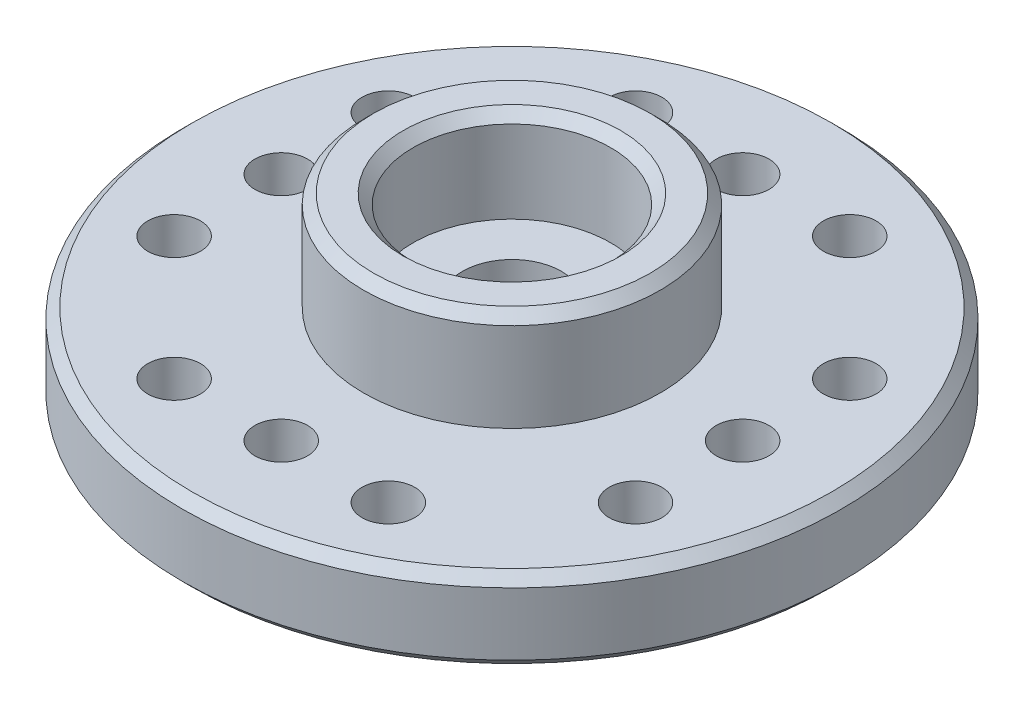
ISO-10303-21;
HEADER;
FILE_DESCRIPTION(('STEP AP214'),'2;1');
FILE_NAME('part.step','',(''),(''),'','','');
FILE_SCHEMA(('AUTOMOTIVE_DESIGN { 1 0 10303 214 1 1 1 1 }'));
ENDSEC;
DATA;
#1=APPLICATION_CONTEXT('core data for automotive mechanical design processes');
#2=APPLICATION_PROTOCOL_DEFINITION('international standard','automotive_design',2000,#1);
#3=PRODUCT_CONTEXT('',#1,'mechanical');
#4=PRODUCT('Part','Part','',(#3));
#5=PRODUCT_RELATED_PRODUCT_CATEGORY('part','',(#4));
#6=PRODUCT_DEFINITION_FORMATION('','',#4);
#7=PRODUCT_DEFINITION_CONTEXT('part definition',#1,'design');
#8=PRODUCT_DEFINITION('design','',#6,#7);
#9=PRODUCT_DEFINITION_SHAPE('','',#8);
#10=(LENGTH_UNIT() NAMED_UNIT(*) SI_UNIT(.MILLI.,.METRE.));
#11=(NAMED_UNIT(*) PLANE_ANGLE_UNIT() SI_UNIT($,.RADIAN.));
#12=(NAMED_UNIT(*) SI_UNIT($,.STERADIAN.) SOLID_ANGLE_UNIT());
#13=UNCERTAINTY_MEASURE_WITH_UNIT(LENGTH_MEASURE(1.E-05),#10,'distance_accuracy_value','');
#14=(GEOMETRIC_REPRESENTATION_CONTEXT(3) GLOBAL_UNCERTAINTY_ASSIGNED_CONTEXT((#13)) GLOBAL_UNIT_ASSIGNED_CONTEXT((#10,
#11,#12)) REPRESENTATION_CONTEXT('',''));
#15=CARTESIAN_POINT('',(0.,0.,0.));
#16=DIRECTION('',(0.,0.,1.));
#17=DIRECTION('',(1.,0.,0.));
#18=AXIS2_PLACEMENT_3D('',#15,#16,#17);
#19=CARTESIAN_POINT('',(0.,5.5,0.));
#20=DIRECTION('',(0.,-1.,0.));
#21=DIRECTION('',(0.,0.,-1.));
#22=AXIS2_PLACEMENT_3D('',#19,#20,#21);
#23=CYLINDRICAL_SURFACE('',#22,1.5);
#24=CARTESIAN_POINT('',(0.,2.7,0.));
#25=DIRECTION('',(0.,1.,0.));
#26=DIRECTION('',(0.,0.,1.));
#27=AXIS2_PLACEMENT_3D('',#24,#25,#26);
#28=CIRCLE('',#27,1.5);
#29=CARTESIAN_POINT('',(0.,2.7,1.5));
#30=VERTEX_POINT('',#29);
#31=EDGE_CURVE('E77',#30,#30,#28,.T.);
#32=ORIENTED_EDGE('',*,*,#31,.T.);
#33=EDGE_LOOP('',(#32));
#34=FACE_BOUND('',#33,.T.);
#35=CARTESIAN_POINT('',(0.,1.,0.));
#36=DIRECTION('',(0.,-1.,0.));
#37=DIRECTION('',(0.,0.,-1.));
#38=AXIS2_PLACEMENT_3D('',#35,#36,#37);
#39=CIRCLE('',#38,1.5);
#40=CARTESIAN_POINT('',(0.,1.,-1.5));
#41=VERTEX_POINT('',#40);
#42=EDGE_CURVE('E161',#41,#41,#39,.F.);
#43=ORIENTED_EDGE('',*,*,#42,.F.);
#44=EDGE_LOOP('',(#43));
#45=FACE_BOUND('',#44,.T.);
#46=ADVANCED_FACE('F43',(#34,#45),#23,.F.);
#47=CARTESIAN_POINT('',(0.,2.5,0.));
#48=DIRECTION('',(0.,-1.,0.));
#49=DIRECTION('',(0.,0.,-1.));
#50=AXIS2_PLACEMENT_3D('',#47,#48,#49);
#51=CYLINDRICAL_SURFACE('',#50,10.);
#52=CARTESIAN_POINT('',(0.,0.299999999999996,0.));
#53=DIRECTION('',(0.,1.,0.));
#54=DIRECTION('',(0.,0.,1.));
#55=AXIS2_PLACEMENT_3D('',#52,#53,#54);
#56=CIRCLE('',#55,10.);
#57=CARTESIAN_POINT('',(0.,0.299999999999996,10.));
#58=VERTEX_POINT('',#57);
#59=EDGE_CURVE('E70',#58,#58,#56,.T.);
#60=ORIENTED_EDGE('',*,*,#59,.T.);
#61=EDGE_LOOP('',(#60));
#62=FACE_BOUND('',#61,.T.);
#63=CARTESIAN_POINT('',(0.,2.19999999999999,0.));
#64=DIRECTION('',(0.,1.,0.));
#65=DIRECTION('',(0.,0.,1.));
#66=AXIS2_PLACEMENT_3D('',#63,#64,#65);
#67=CIRCLE('',#66,10.);
#68=CARTESIAN_POINT('',(0.,2.19999999999999,10.));
#69=VERTEX_POINT('',#68);
#70=EDGE_CURVE('E73',#69,#69,#67,.F.);
#71=ORIENTED_EDGE('',*,*,#70,.T.);
#72=EDGE_LOOP('',(#71));
#73=FACE_BOUND('',#72,.T.);
#74=ADVANCED_FACE('F245',(#62,#73),#51,.T.);
#75=CARTESIAN_POINT('',(0.,2.5,0.));
#76=DIRECTION('',(0.,1.,0.));
#77=DIRECTION('',(0.,0.,1.));
#78=AXIS2_PLACEMENT_3D('',#75,#76,#77);
#79=PLANE('',#78);
#80=CARTESIAN_POINT('',(0.,2.5,0.));
#81=DIRECTION('',(0.,1.,0.));
#82=DIRECTION('',(0.,0.,1.));
#83=AXIS2_PLACEMENT_3D('',#80,#81,#82);
#84=CIRCLE('',#83,9.69999999999999);
#85=CARTESIAN_POINT('',(0.,2.5,9.69999999999999));
#86=VERTEX_POINT('',#85);
#87=EDGE_CURVE('E64',#86,#86,#84,.T.);
#88=ORIENTED_EDGE('',*,*,#87,.T.);
#89=EDGE_LOOP('',(#88));
#90=FACE_BOUND('',#89,.T.);
#91=CARTESIAN_POINT('',(3.25,2.5,-7.));
#92=DIRECTION('',(0.,1.,0.));
#93=DIRECTION('',(0.,0.,1.));
#94=AXIS2_PLACEMENT_3D('',#91,#92,#93);
#95=CIRCLE('',#94,0.8);
#96=CARTESIAN_POINT('',(3.25,2.5,-6.2));
#97=VERTEX_POINT('',#96);
#98=EDGE_CURVE('E87',#97,#97,#95,.T.);
#99=ORIENTED_EDGE('',*,*,#98,.F.);
#100=EDGE_LOOP('',(#99));
#101=FACE_BOUND('',#100,.T.);
#102=CARTESIAN_POINT('',(0.,2.5,-7.));
#103=DIRECTION('',(0.,1.,0.));
#104=DIRECTION('',(0.,0.,1.));
#105=AXIS2_PLACEMENT_3D('',#102,#103,#104);
#106=CIRCLE('',#105,0.8);
#107=CARTESIAN_POINT('',(0.,2.5,-6.2));
#108=VERTEX_POINT('',#107);
#109=EDGE_CURVE('E90',#108,#108,#106,.T.);
#110=ORIENTED_EDGE('',*,*,#109,.F.);
#111=EDGE_LOOP('',(#110));
#112=FACE_BOUND('',#111,.T.);
#113=CARTESIAN_POINT('',(7.,2.5,-3.25));
#114=DIRECTION('',(0.,1.,0.));
#115=DIRECTION('',(0.,0.,1.));
#116=AXIS2_PLACEMENT_3D('',#113,#114,#115);
#117=CIRCLE('',#116,0.800000000000001);
#118=CARTESIAN_POINT('',(7.,2.5,-2.45));
#119=VERTEX_POINT('',#118);
#120=EDGE_CURVE('E93',#119,#119,#117,.T.);
#121=ORIENTED_EDGE('',*,*,#120,.F.);
#122=EDGE_LOOP('',(#121));
#123=FACE_BOUND('',#122,.T.);
#124=CARTESIAN_POINT('',(7.,2.5,3.25));
#125=DIRECTION('',(0.,1.,0.));
#126=DIRECTION('',(0.,0.,1.));
#127=AXIS2_PLACEMENT_3D('',#124,#125,#126);
#128=CIRCLE('',#127,0.800000000000001);
#129=CARTESIAN_POINT('',(7.,2.5,4.05));
#130=VERTEX_POINT('',#129);
#131=EDGE_CURVE('E96',#130,#130,#128,.T.);
#132=ORIENTED_EDGE('',*,*,#131,.F.);
#133=EDGE_LOOP('',(#132));
#134=FACE_BOUND('',#133,.T.);
#135=CARTESIAN_POINT('',(3.25,2.5,7.));
#136=DIRECTION('',(0.,1.,0.));
#137=DIRECTION('',(0.,0.,1.));
#138=AXIS2_PLACEMENT_3D('',#135,#136,#137);
#139=CIRCLE('',#138,0.8);
#140=CARTESIAN_POINT('',(3.25,2.5,7.8));
#141=VERTEX_POINT('',#140);
#142=EDGE_CURVE('E99',#141,#141,#139,.T.);
#143=ORIENTED_EDGE('',*,*,#142,.F.);
#144=EDGE_LOOP('',(#143));
#145=FACE_BOUND('',#144,.T.);
#146=CARTESIAN_POINT('',(-3.25,2.5,7.));
#147=DIRECTION('',(0.,1.,0.));
#148=DIRECTION('',(0.,0.,1.));
#149=AXIS2_PLACEMENT_3D('',#146,#147,#148);
#150=CIRCLE('',#149,0.8);
#151=CARTESIAN_POINT('',(-3.25,2.5,7.8));
#152=VERTEX_POINT('',#151);
#153=EDGE_CURVE('E102',#152,#152,#150,.T.);
#154=ORIENTED_EDGE('',*,*,#153,.F.);
#155=EDGE_LOOP('',(#154));
#156=FACE_BOUND('',#155,.T.);
#157=CARTESIAN_POINT('',(7.,2.5,0.));
#158=DIRECTION('',(0.,1.,0.));
#159=DIRECTION('',(0.,0.,1.));
#160=AXIS2_PLACEMENT_3D('',#157,#158,#159);
#161=CIRCLE('',#160,0.8);
#162=CARTESIAN_POINT('',(7.,2.5,0.800000000000002));
#163=VERTEX_POINT('',#162);
#164=EDGE_CURVE('E105',#163,#163,#161,.T.);
#165=ORIENTED_EDGE('',*,*,#164,.F.);
#166=EDGE_LOOP('',(#165));
#167=FACE_BOUND('',#166,.T.);
#168=CARTESIAN_POINT('',(-7.,2.5,3.25));
#169=DIRECTION('',(0.,1.,0.));
#170=DIRECTION('',(0.,0.,1.));
#171=AXIS2_PLACEMENT_3D('',#168,#169,#170);
#172=CIRCLE('',#171,0.800000000000001);
#173=CARTESIAN_POINT('',(-7.,2.5,4.05));
#174=VERTEX_POINT('',#173);
#175=EDGE_CURVE('E108',#174,#174,#172,.T.);
#176=ORIENTED_EDGE('',*,*,#175,.F.);
#177=EDGE_LOOP('',(#176));
#178=FACE_BOUND('',#177,.T.);
#179=CARTESIAN_POINT('',(-7.,2.5,-3.25));
#180=DIRECTION('',(0.,1.,0.));
#181=DIRECTION('',(0.,0.,1.));
#182=AXIS2_PLACEMENT_3D('',#179,#180,#181);
#183=CIRCLE('',#182,0.800000000000001);
#184=CARTESIAN_POINT('',(-7.,2.5,-2.45));
#185=VERTEX_POINT('',#184);
#186=EDGE_CURVE('E111',#185,#185,#183,.T.);
#187=ORIENTED_EDGE('',*,*,#186,.F.);
#188=EDGE_LOOP('',(#187));
#189=FACE_BOUND('',#188,.T.);
#190=CARTESIAN_POINT('',(-7.,2.5,0.));
#191=DIRECTION('',(0.,1.,0.));
#192=DIRECTION('',(0.,0.,1.));
#193=AXIS2_PLACEMENT_3D('',#190,#191,#192);
#194=CIRCLE('',#193,0.800000000000001);
#195=CARTESIAN_POINT('',(-7.,2.5,0.8));
#196=VERTEX_POINT('',#195);
#197=EDGE_CURVE('E114',#196,#196,#194,.T.);
#198=ORIENTED_EDGE('',*,*,#197,.F.);
#199=EDGE_LOOP('',(#198));
#200=FACE_BOUND('',#199,.T.);
#201=CARTESIAN_POINT('',(-3.25,2.5,-7.));
#202=DIRECTION('',(0.,1.,0.));
#203=DIRECTION('',(0.,0.,1.));
#204=AXIS2_PLACEMENT_3D('',#201,#202,#203);
#205=CIRCLE('',#204,0.8);
#206=CARTESIAN_POINT('',(-3.25,2.5,-6.2));
#207=VERTEX_POINT('',#206);
#208=EDGE_CURVE('E117',#207,#207,#205,.T.);
#209=ORIENTED_EDGE('',*,*,#208,.F.);
#210=EDGE_LOOP('',(#209));
#211=FACE_BOUND('',#210,.T.);
#212=CARTESIAN_POINT('',(0.,2.5,7.));
#213=DIRECTION('',(0.,1.,0.));
#214=DIRECTION('',(0.,0.,1.));
#215=AXIS2_PLACEMENT_3D('',#212,#213,#214);
#216=CIRCLE('',#215,0.8);
#217=CARTESIAN_POINT('',(0.,2.5,7.8));
#218=VERTEX_POINT('',#217);
#219=EDGE_CURVE('E80',#218,#218,#216,.T.);
#220=ORIENTED_EDGE('',*,*,#219,.F.);
#221=EDGE_LOOP('',(#220));
#222=FACE_BOUND('',#221,.T.);
#223=CARTESIAN_POINT('',(0.,2.5,0.));
#224=DIRECTION('',(0.,1.,0.));
#225=DIRECTION('',(0.,0.,1.));
#226=AXIS2_PLACEMENT_3D('',#223,#224,#225);
#227=CIRCLE('',#226,4.5);
#228=CARTESIAN_POINT('',(0.,2.5,4.5));
#229=VERTEX_POINT('',#228);
#230=EDGE_CURVE('E76',#229,#229,#227,.T.);
#231=ORIENTED_EDGE('',*,*,#230,.F.);
#232=EDGE_LOOP('',(#231));
#233=FACE_BOUND('',#232,.T.);
#234=ADVANCED_FACE('F198',(#90,#101,#112,#123,#134,#145,#156,#167,#178,#189,#200,#211,#222,
#233),#79,.T.);
#235=CARTESIAN_POINT('',(0.,0.,0.));
#236=DIRECTION('',(0.,1.,0.));
#237=DIRECTION('',(0.,0.,1.));
#238=AXIS2_PLACEMENT_3D('',#235,#236,#237);
#239=PLANE('',#238);
#240=CARTESIAN_POINT('',(0.,0.,0.));
#241=DIRECTION('',(0.,-1.,0.));
#242=DIRECTION('',(0.,0.,-1.));
#243=AXIS2_PLACEMENT_3D('',#240,#241,#242);
#244=CIRCLE('',#243,4.5);
#245=CARTESIAN_POINT('',(0.,0.,-4.5));
#246=VERTEX_POINT('',#245);
#247=EDGE_CURVE('E167',#246,#246,#244,.T.);
#248=ORIENTED_EDGE('',*,*,#247,.F.);
#249=EDGE_LOOP('',(#248));
#250=FACE_BOUND('',#249,.T.);
#251=CARTESIAN_POINT('',(0.,0.,0.));
#252=DIRECTION('',(0.,1.,0.));
#253=DIRECTION('',(0.,0.,1.));
#254=AXIS2_PLACEMENT_3D('',#251,#252,#253);
#255=CIRCLE('',#254,9.7);
#256=CARTESIAN_POINT('',(0.,0.,9.7));
#257=VERTEX_POINT('',#256);
#258=EDGE_CURVE('E67',#257,#257,#255,.F.);
#259=ORIENTED_EDGE('',*,*,#258,.T.);
#260=EDGE_LOOP('',(#259));
#261=FACE_BOUND('',#260,.T.);
#262=CARTESIAN_POINT('',(3.25,0.,-7.));
#263=DIRECTION('',(0.,-1.,0.));
#264=DIRECTION('',(0.,0.,-1.));
#265=AXIS2_PLACEMENT_3D('',#262,#263,#264);
#266=CIRCLE('',#265,0.8);
#267=CARTESIAN_POINT('',(3.25,0.,-7.8));
#268=VERTEX_POINT('',#267);
#269=EDGE_CURVE('E134',#268,#268,#266,.T.);
#270=ORIENTED_EDGE('',*,*,#269,.F.);
#271=EDGE_LOOP('',(#270));
#272=FACE_BOUND('',#271,.T.);
#273=CARTESIAN_POINT('',(0.,0.,-7.));
#274=DIRECTION('',(0.,-1.,0.));
#275=DIRECTION('',(0.,0.,-1.));
#276=AXIS2_PLACEMENT_3D('',#273,#274,#275);
#277=CIRCLE('',#276,0.8);
#278=CARTESIAN_POINT('',(0.,0.,-7.8));
#279=VERTEX_POINT('',#278);
#280=EDGE_CURVE('E137',#279,#279,#277,.T.);
#281=ORIENTED_EDGE('',*,*,#280,.F.);
#282=EDGE_LOOP('',(#281));
#283=FACE_BOUND('',#282,.T.);
#284=CARTESIAN_POINT('',(7.,0.,-3.25));
#285=DIRECTION('',(0.,-1.,0.));
#286=DIRECTION('',(0.,0.,-1.));
#287=AXIS2_PLACEMENT_3D('',#284,#285,#286);
#288=CIRCLE('',#287,0.800000000000001);
#289=CARTESIAN_POINT('',(7.,0.,-4.05));
#290=VERTEX_POINT('',#289);
#291=EDGE_CURVE('E141',#290,#290,#288,.T.);
#292=ORIENTED_EDGE('',*,*,#291,.F.);
#293=EDGE_LOOP('',(#292));
#294=FACE_BOUND('',#293,.T.);
#295=CARTESIAN_POINT('',(7.,0.,3.25));
#296=DIRECTION('',(0.,-1.,0.));
#297=DIRECTION('',(0.,0.,-1.));
#298=AXIS2_PLACEMENT_3D('',#295,#296,#297);
#299=CIRCLE('',#298,0.800000000000001);
#300=CARTESIAN_POINT('',(7.,0.,2.45));
#301=VERTEX_POINT('',#300);
#302=EDGE_CURVE('E129',#301,#301,#299,.T.);
#303=ORIENTED_EDGE('',*,*,#302,.F.);
#304=EDGE_LOOP('',(#303));
#305=FACE_BOUND('',#304,.T.);
#306=CARTESIAN_POINT('',(3.25,0.,7.));
#307=DIRECTION('',(0.,-1.,0.));
#308=DIRECTION('',(0.,0.,-1.));
#309=AXIS2_PLACEMENT_3D('',#306,#307,#308);
#310=CIRCLE('',#309,0.8);
#311=CARTESIAN_POINT('',(3.25,0.,6.2));
#312=VERTEX_POINT('',#311);
#313=EDGE_CURVE('E125',#312,#312,#310,.T.);
#314=ORIENTED_EDGE('',*,*,#313,.F.);
#315=EDGE_LOOP('',(#314));
#316=FACE_BOUND('',#315,.T.);
#317=CARTESIAN_POINT('',(-3.25,0.,7.));
#318=DIRECTION('',(0.,-1.,0.));
#319=DIRECTION('',(0.,0.,-1.));
#320=AXIS2_PLACEMENT_3D('',#317,#318,#319);
#321=CIRCLE('',#320,0.8);
#322=CARTESIAN_POINT('',(-3.25,0.,6.2));
#323=VERTEX_POINT('',#322);
#324=EDGE_CURVE('E128',#323,#323,#321,.T.);
#325=ORIENTED_EDGE('',*,*,#324,.F.);
#326=EDGE_LOOP('',(#325));
#327=FACE_BOUND('',#326,.T.);
#328=CARTESIAN_POINT('',(7.,0.,0.));
#329=DIRECTION('',(0.,-1.,0.));
#330=DIRECTION('',(0.,0.,-1.));
#331=AXIS2_PLACEMENT_3D('',#328,#329,#330);
#332=CIRCLE('',#331,0.8);
#333=CARTESIAN_POINT('',(7.,0.,-0.799999999999998));
#334=VERTEX_POINT('',#333);
#335=EDGE_CURVE('E124',#334,#334,#332,.T.);
#336=ORIENTED_EDGE('',*,*,#335,.F.);
#337=EDGE_LOOP('',(#336));
#338=FACE_BOUND('',#337,.T.);
#339=CARTESIAN_POINT('',(-7.,0.,3.25));
#340=DIRECTION('',(0.,-1.,0.));
#341=DIRECTION('',(0.,0.,-1.));
#342=AXIS2_PLACEMENT_3D('',#339,#340,#341);
#343=CIRCLE('',#342,0.800000000000001);
#344=CARTESIAN_POINT('',(-7.,0.,2.45));
#345=VERTEX_POINT('',#344);
#346=EDGE_CURVE('E152',#345,#345,#343,.T.);
#347=ORIENTED_EDGE('',*,*,#346,.F.);
#348=EDGE_LOOP('',(#347));
#349=FACE_BOUND('',#348,.T.);
#350=CARTESIAN_POINT('',(-7.,0.,-3.25));
#351=DIRECTION('',(0.,-1.,0.));
#352=DIRECTION('',(0.,0.,-1.));
#353=AXIS2_PLACEMENT_3D('',#350,#351,#352);
#354=CIRCLE('',#353,0.800000000000001);
#355=CARTESIAN_POINT('',(-7.,0.,-4.05));
#356=VERTEX_POINT('',#355);
#357=EDGE_CURVE('E149',#356,#356,#354,.T.);
#358=ORIENTED_EDGE('',*,*,#357,.F.);
#359=EDGE_LOOP('',(#358));
#360=FACE_BOUND('',#359,.T.);
#361=CARTESIAN_POINT('',(-7.,0.,0.));
#362=DIRECTION('',(0.,-1.,0.));
#363=DIRECTION('',(0.,0.,-1.));
#364=AXIS2_PLACEMENT_3D('',#361,#362,#363);
#365=CIRCLE('',#364,0.800000000000001);
#366=CARTESIAN_POINT('',(-7.,0.,-0.800000000000002));
#367=VERTEX_POINT('',#366);
#368=EDGE_CURVE('E146',#367,#367,#365,.T.);
#369=ORIENTED_EDGE('',*,*,#368,.F.);
#370=EDGE_LOOP('',(#369));
#371=FACE_BOUND('',#370,.T.);
#372=CARTESIAN_POINT('',(-3.25,0.,-7.));
#373=DIRECTION('',(0.,-1.,0.));
#374=DIRECTION('',(0.,0.,-1.));
#375=AXIS2_PLACEMENT_3D('',#372,#373,#374);
#376=CIRCLE('',#375,0.8);
#377=CARTESIAN_POINT('',(-3.25,0.,-7.8));
#378=VERTEX_POINT('',#377);
#379=EDGE_CURVE('E138',#378,#378,#376,.T.);
#380=ORIENTED_EDGE('',*,*,#379,.F.);
#381=EDGE_LOOP('',(#380));
#382=FACE_BOUND('',#381,.T.);
#383=CARTESIAN_POINT('',(0.,0.,7.));
#384=DIRECTION('',(0.,-1.,0.));
#385=DIRECTION('',(0.,0.,-1.));
#386=AXIS2_PLACEMENT_3D('',#383,#384,#385);
#387=CIRCLE('',#386,0.8);
#388=CARTESIAN_POINT('',(0.,0.,6.2));
#389=VERTEX_POINT('',#388);
#390=EDGE_CURVE('E81',#389,#389,#387,.T.);
#391=ORIENTED_EDGE('',*,*,#390,.F.);
#392=EDGE_LOOP('',(#391));
#393=FACE_BOUND('',#392,.T.);
#394=ADVANCED_FACE('F194',(#250,#261,#272,#283,#294,#305,#316,#327,#338,#349,#360,#371,#382,
#393),#239,.F.);
#395=CARTESIAN_POINT('',(0.,5.5,0.));
#396=DIRECTION('',(0.,-1.,0.));
#397=DIRECTION('',(0.,0.,-1.));
#398=AXIS2_PLACEMENT_3D('',#395,#396,#397);
#399=CYLINDRICAL_SURFACE('',#398,4.5);
#400=CARTESIAN_POINT('',(0.,5.2,0.));
#401=DIRECTION('',(0.,1.,0.));
#402=DIRECTION('',(0.,0.,1.));
#403=AXIS2_PLACEMENT_3D('',#400,#401,#402);
#404=CIRCLE('',#403,4.5);
#405=CARTESIAN_POINT('',(0.,5.2,4.5));
#406=VERTEX_POINT('',#405);
#407=EDGE_CURVE('E51',#406,#406,#404,.F.);
#408=ORIENTED_EDGE('',*,*,#407,.T.);
#409=EDGE_LOOP('',(#408));
#410=FACE_BOUND('',#409,.T.);
#411=ORIENTED_EDGE('',*,*,#230,.T.);
#412=EDGE_LOOP('',(#411));
#413=FACE_BOUND('',#412,.T.);
#414=ADVANCED_FACE('F197',(#410,#413),#399,.T.);
#415=CARTESIAN_POINT('',(0.,5.5,0.));
#416=DIRECTION('',(0.,1.,0.));
#417=DIRECTION('',(0.,0.,1.));
#418=AXIS2_PLACEMENT_3D('',#415,#416,#417);
#419=PLANE('',#418);
#420=CARTESIAN_POINT('',(0.,5.5,0.));
#421=DIRECTION('',(0.,1.,0.));
#422=DIRECTION('',(0.,0.,1.));
#423=AXIS2_PLACEMENT_3D('',#420,#421,#422);
#424=CIRCLE('',#423,4.2);
#425=CARTESIAN_POINT('',(0.,5.5,4.2));
#426=VERTEX_POINT('',#425);
#427=EDGE_CURVE('E55',#426,#426,#424,.T.);
#428=ORIENTED_EDGE('',*,*,#427,.T.);
#429=EDGE_LOOP('',(#428));
#430=FACE_BOUND('',#429,.T.);
#431=CARTESIAN_POINT('',(0.,5.5,0.));
#432=DIRECTION('',(0.,1.,0.));
#433=DIRECTION('',(0.,0.,1.));
#434=AXIS2_PLACEMENT_3D('',#431,#432,#433);
#435=CIRCLE('',#434,3.30000000000001);
#436=CARTESIAN_POINT('',(0.,5.5,3.30000000000001));
#437=VERTEX_POINT('',#436);
#438=EDGE_CURVE('E59',#437,#437,#435,.F.);
#439=ORIENTED_EDGE('',*,*,#438,.T.);
#440=EDGE_LOOP('',(#439));
#441=FACE_BOUND('',#440,.T.);
#442=ADVANCED_FACE('F300',(#430,#441),#419,.T.);
#443=CARTESIAN_POINT('',(0.,2.7,0.));
#444=DIRECTION('',(0.,1.,0.));
#445=DIRECTION('',(0.,0.,1.));
#446=AXIS2_PLACEMENT_3D('',#443,#444,#445);
#447=CYLINDRICAL_SURFACE('',#446,3.);
#448=CARTESIAN_POINT('',(0.,5.19999999999999,0.));
#449=DIRECTION('',(0.,1.,0.));
#450=DIRECTION('',(0.,0.,1.));
#451=AXIS2_PLACEMENT_3D('',#448,#449,#450);
#452=CIRCLE('',#451,3.);
#453=CARTESIAN_POINT('',(0.,5.19999999999999,3.));
#454=VERTEX_POINT('',#453);
#455=EDGE_CURVE('E11',#454,#454,#452,.T.);
#456=ORIENTED_EDGE('',*,*,#455,.T.);
#457=EDGE_LOOP('',(#456));
#458=FACE_BOUND('',#457,.T.);
#459=CARTESIAN_POINT('',(0.,2.7,0.));
#460=DIRECTION('',(0.,1.,0.));
#461=DIRECTION('',(0.,0.,1.));
#462=AXIS2_PLACEMENT_3D('',#459,#460,#461);
#463=CIRCLE('',#462,3.);
#464=CARTESIAN_POINT('',(0.,2.7,3.));
#465=VERTEX_POINT('',#464);
#466=EDGE_CURVE('E84',#465,#465,#463,.T.);
#467=ORIENTED_EDGE('',*,*,#466,.F.);
#468=EDGE_LOOP('',(#467));
#469=FACE_BOUND('',#468,.T.);
#470=ADVANCED_FACE('F240',(#458,#469),#447,.F.);
#471=CARTESIAN_POINT('',(0.,2.7,0.));
#472=DIRECTION('',(0.,1.,0.));
#473=DIRECTION('',(0.,0.,1.));
#474=AXIS2_PLACEMENT_3D('',#471,#472,#473);
#475=PLANE('',#474);
#476=ORIENTED_EDGE('',*,*,#31,.F.);
#477=EDGE_LOOP('',(#476));
#478=FACE_BOUND('',#477,.T.);
#479=ORIENTED_EDGE('',*,*,#466,.T.);
#480=EDGE_LOOP('',(#479));
#481=FACE_BOUND('',#480,.T.);
#482=ADVANCED_FACE('F230',(#478,#481),#475,.T.);
#483=CARTESIAN_POINT('',(0.,5.5,7.));
#484=DIRECTION('',(0.,-1.,0.));
#485=DIRECTION('',(0.,0.,-1.));
#486=AXIS2_PLACEMENT_3D('',#483,#484,#485);
#487=CYLINDRICAL_SURFACE('',#486,0.8);
#488=ORIENTED_EDGE('',*,*,#219,.T.);
#489=EDGE_LOOP('',(#488));
#490=FACE_BOUND('',#489,.T.);
#491=ORIENTED_EDGE('',*,*,#390,.T.);
#492=EDGE_LOOP('',(#491));
#493=FACE_BOUND('',#492,.T.);
#494=ADVANCED_FACE('F227',(#490,#493),#487,.F.);
#495=CARTESIAN_POINT('',(-3.25,5.5,-7.));
#496=DIRECTION('',(0.,-1.,0.));
#497=DIRECTION('',(0.,0.,-1.));
#498=AXIS2_PLACEMENT_3D('',#495,#496,#497);
#499=CYLINDRICAL_SURFACE('',#498,0.8);
#500=ORIENTED_EDGE('',*,*,#208,.T.);
#501=EDGE_LOOP('',(#500));
#502=FACE_BOUND('',#501,.T.);
#503=ORIENTED_EDGE('',*,*,#379,.T.);
#504=EDGE_LOOP('',(#503));
#505=FACE_BOUND('',#504,.T.);
#506=ADVANCED_FACE('F229',(#502,#505),#499,.F.);
#507=CARTESIAN_POINT('',(-7.,5.5,0.));
#508=DIRECTION('',(0.,-1.,0.));
#509=DIRECTION('',(0.,0.,-1.));
#510=AXIS2_PLACEMENT_3D('',#507,#508,#509);
#511=CYLINDRICAL_SURFACE('',#510,0.800000000000001);
#512=ORIENTED_EDGE('',*,*,#197,.T.);
#513=EDGE_LOOP('',(#512));
#514=FACE_BOUND('',#513,.T.);
#515=ORIENTED_EDGE('',*,*,#368,.T.);
#516=EDGE_LOOP('',(#515));
#517=FACE_BOUND('',#516,.T.);
#518=ADVANCED_FACE('F237',(#514,#517),#511,.F.);
#519=CARTESIAN_POINT('',(-7.,5.5,-3.25));
#520=DIRECTION('',(0.,-1.,0.));
#521=DIRECTION('',(0.,0.,-1.));
#522=AXIS2_PLACEMENT_3D('',#519,#520,#521);
#523=CYLINDRICAL_SURFACE('',#522,0.800000000000001);
#524=ORIENTED_EDGE('',*,*,#186,.T.);
#525=EDGE_LOOP('',(#524));
#526=FACE_BOUND('',#525,.T.);
#527=ORIENTED_EDGE('',*,*,#357,.T.);
#528=EDGE_LOOP('',(#527));
#529=FACE_BOUND('',#528,.T.);
#530=ADVANCED_FACE('F353',(#526,#529),#523,.F.);
#531=CARTESIAN_POINT('',(-7.,5.5,3.25));
#532=DIRECTION('',(0.,-1.,0.));
#533=DIRECTION('',(0.,0.,-1.));
#534=AXIS2_PLACEMENT_3D('',#531,#532,#533);
#535=CYLINDRICAL_SURFACE('',#534,0.800000000000001);
#536=ORIENTED_EDGE('',*,*,#175,.T.);
#537=EDGE_LOOP('',(#536));
#538=FACE_BOUND('',#537,.T.);
#539=ORIENTED_EDGE('',*,*,#346,.T.);
#540=EDGE_LOOP('',(#539));
#541=FACE_BOUND('',#540,.T.);
#542=ADVANCED_FACE('F262',(#538,#541),#535,.F.);
#543=CARTESIAN_POINT('',(7.,5.5,0.));
#544=DIRECTION('',(0.,-1.,0.));
#545=DIRECTION('',(0.,0.,-1.));
#546=AXIS2_PLACEMENT_3D('',#543,#544,#545);
#547=CYLINDRICAL_SURFACE('',#546,0.8);
#548=ORIENTED_EDGE('',*,*,#164,.T.);
#549=EDGE_LOOP('',(#548));
#550=FACE_BOUND('',#549,.T.);
#551=ORIENTED_EDGE('',*,*,#335,.T.);
#552=EDGE_LOOP('',(#551));
#553=FACE_BOUND('',#552,.T.);
#554=ADVANCED_FACE('F258',(#550,#553),#547,.F.);
#555=CARTESIAN_POINT('',(-3.25,5.5,7.));
#556=DIRECTION('',(0.,-1.,0.));
#557=DIRECTION('',(0.,0.,-1.));
#558=AXIS2_PLACEMENT_3D('',#555,#556,#557);
#559=CYLINDRICAL_SURFACE('',#558,0.8);
#560=ORIENTED_EDGE('',*,*,#153,.T.);
#561=EDGE_LOOP('',(#560));
#562=FACE_BOUND('',#561,.T.);
#563=ORIENTED_EDGE('',*,*,#324,.T.);
#564=EDGE_LOOP('',(#563));
#565=FACE_BOUND('',#564,.T.);
#566=ADVANCED_FACE('F261',(#562,#565),#559,.F.);
#567=CARTESIAN_POINT('',(3.25,5.5,7.));
#568=DIRECTION('',(0.,-1.,0.));
#569=DIRECTION('',(0.,0.,-1.));
#570=AXIS2_PLACEMENT_3D('',#567,#568,#569);
#571=CYLINDRICAL_SURFACE('',#570,0.8);
#572=ORIENTED_EDGE('',*,*,#142,.T.);
#573=EDGE_LOOP('',(#572));
#574=FACE_BOUND('',#573,.T.);
#575=ORIENTED_EDGE('',*,*,#313,.T.);
#576=EDGE_LOOP('',(#575));
#577=FACE_BOUND('',#576,.T.);
#578=ADVANCED_FACE('F265',(#574,#577),#571,.F.);
#579=CARTESIAN_POINT('',(7.,5.5,3.25));
#580=DIRECTION('',(0.,-1.,0.));
#581=DIRECTION('',(0.,0.,-1.));
#582=AXIS2_PLACEMENT_3D('',#579,#580,#581);
#583=CYLINDRICAL_SURFACE('',#582,0.800000000000001);
#584=ORIENTED_EDGE('',*,*,#131,.T.);
#585=EDGE_LOOP('',(#584));
#586=FACE_BOUND('',#585,.T.);
#587=ORIENTED_EDGE('',*,*,#302,.T.);
#588=EDGE_LOOP('',(#587));
#589=FACE_BOUND('',#588,.T.);
#590=ADVANCED_FACE('F268',(#586,#589),#583,.F.);
#591=CARTESIAN_POINT('',(7.,5.5,-3.25));
#592=DIRECTION('',(0.,-1.,0.));
#593=DIRECTION('',(0.,0.,-1.));
#594=AXIS2_PLACEMENT_3D('',#591,#592,#593);
#595=CYLINDRICAL_SURFACE('',#594,0.800000000000001);
#596=ORIENTED_EDGE('',*,*,#120,.T.);
#597=EDGE_LOOP('',(#596));
#598=FACE_BOUND('',#597,.T.);
#599=ORIENTED_EDGE('',*,*,#291,.T.);
#600=EDGE_LOOP('',(#599));
#601=FACE_BOUND('',#600,.T.);
#602=ADVANCED_FACE('F273',(#598,#601),#595,.F.);
#603=CARTESIAN_POINT('',(0.,5.5,-7.));
#604=DIRECTION('',(0.,-1.,0.));
#605=DIRECTION('',(0.,0.,-1.));
#606=AXIS2_PLACEMENT_3D('',#603,#604,#605);
#607=CYLINDRICAL_SURFACE('',#606,0.8);
#608=ORIENTED_EDGE('',*,*,#109,.T.);
#609=EDGE_LOOP('',(#608));
#610=FACE_BOUND('',#609,.T.);
#611=ORIENTED_EDGE('',*,*,#280,.T.);
#612=EDGE_LOOP('',(#611));
#613=FACE_BOUND('',#612,.T.);
#614=ADVANCED_FACE('F364',(#610,#613),#607,.F.);
#615=CARTESIAN_POINT('',(3.25,5.5,-7.));
#616=DIRECTION('',(0.,-1.,0.));
#617=DIRECTION('',(0.,0.,-1.));
#618=AXIS2_PLACEMENT_3D('',#615,#616,#617);
#619=CYLINDRICAL_SURFACE('',#618,0.8);
#620=ORIENTED_EDGE('',*,*,#98,.T.);
#621=EDGE_LOOP('',(#620));
#622=FACE_BOUND('',#621,.T.);
#623=ORIENTED_EDGE('',*,*,#269,.T.);
#624=EDGE_LOOP('',(#623));
#625=FACE_BOUND('',#624,.T.);
#626=ADVANCED_FACE('F256',(#622,#625),#619,.F.);
#627=CARTESIAN_POINT('',(0.,0.299999999999996,0.));
#628=DIRECTION('',(0.,1.,0.));
#629=DIRECTION('',(0.,0.,1.));
#630=AXIS2_PLACEMENT_3D('',#627,#628,#629);
#631=CONICAL_SURFACE('',#630,10.,0.785398163397451);
#632=ORIENTED_EDGE('',*,*,#258,.F.);
#633=EDGE_LOOP('',(#632));
#634=FACE_BOUND('',#633,.T.);
#635=ORIENTED_EDGE('',*,*,#59,.F.);
#636=EDGE_LOOP('',(#635));
#637=FACE_BOUND('',#636,.T.);
#638=ADVANCED_FACE('F310',(#634,#637),#631,.T.);
#639=CARTESIAN_POINT('',(0.,2.5,0.));
#640=DIRECTION('',(0.,-1.,0.));
#641=DIRECTION('',(0.,0.,-1.));
#642=AXIS2_PLACEMENT_3D('',#639,#640,#641);
#643=CONICAL_SURFACE('',#642,9.69999999999999,0.785398163397445);
#644=ORIENTED_EDGE('',*,*,#70,.F.);
#645=EDGE_LOOP('',(#644));
#646=FACE_BOUND('',#645,.T.);
#647=ORIENTED_EDGE('',*,*,#87,.F.);
#648=EDGE_LOOP('',(#647));
#649=FACE_BOUND('',#648,.T.);
#650=ADVANCED_FACE('F316',(#646,#649),#643,.T.);
#651=CARTESIAN_POINT('',(0.,5.5,0.));
#652=DIRECTION('',(0.,-1.,0.));
#653=DIRECTION('',(0.,0.,-1.));
#654=AXIS2_PLACEMENT_3D('',#651,#652,#653);
#655=CONICAL_SURFACE('',#654,4.2,0.785398163397448);
#656=ORIENTED_EDGE('',*,*,#407,.F.);
#657=EDGE_LOOP('',(#656));
#658=FACE_BOUND('',#657,.T.);
#659=ORIENTED_EDGE('',*,*,#427,.F.);
#660=EDGE_LOOP('',(#659));
#661=FACE_BOUND('',#660,.T.);
#662=ADVANCED_FACE('F322',(#658,#661),#655,.T.);
#663=CARTESIAN_POINT('',(0.,5.19999999999999,0.));
#664=DIRECTION('',(0.,1.,0.));
#665=DIRECTION('',(0.,0.,1.));
#666=AXIS2_PLACEMENT_3D('',#663,#664,#665);
#667=CONICAL_SURFACE('',#666,3.,0.785398163397448);
#668=ORIENTED_EDGE('',*,*,#438,.F.);
#669=EDGE_LOOP('',(#668));
#670=FACE_BOUND('',#669,.T.);
#671=ORIENTED_EDGE('',*,*,#455,.F.);
#672=EDGE_LOOP('',(#671));
#673=FACE_BOUND('',#672,.T.);
#674=ADVANCED_FACE('F46',(#670,#673),#667,.F.);
#675=CARTESIAN_POINT('',(0.,1.,0.));
#676=DIRECTION('',(0.,-1.,0.));
#677=DIRECTION('',(0.,0.,-1.));
#678=AXIS2_PLACEMENT_3D('',#675,#676,#677);
#679=CYLINDRICAL_SURFACE('',#678,3.);
#680=CARTESIAN_POINT('',(0.,1.,0.));
#681=DIRECTION('',(0.,-1.,0.));
#682=DIRECTION('',(0.,0.,-1.));
#683=AXIS2_PLACEMENT_3D('',#680,#681,#682);
#684=CIRCLE('',#683,3.);
#685=CARTESIAN_POINT('',(0.,1.,-3.));
#686=VERTEX_POINT('',#685);
#687=EDGE_CURVE('E155',#686,#686,#684,.T.);
#688=ORIENTED_EDGE('',*,*,#687,.F.);
#689=EDGE_LOOP('',(#688));
#690=FACE_BOUND('',#689,.T.);
#691=CARTESIAN_POINT('',(0.,0.,0.));
#692=DIRECTION('',(0.,-1.,0.));
#693=DIRECTION('',(0.,0.,-1.));
#694=AXIS2_PLACEMENT_3D('',#691,#692,#693);
#695=CIRCLE('',#694,3.);
#696=CARTESIAN_POINT('',(0.,0.,-3.));
#697=VERTEX_POINT('',#696);
#698=EDGE_CURVE('E158',#697,#697,#695,.T.);
#699=ORIENTED_EDGE('',*,*,#698,.T.);
#700=EDGE_LOOP('',(#699));
#701=FACE_BOUND('',#700,.T.);
#702=ADVANCED_FACE('F331',(#690,#701),#679,.F.);
#703=CARTESIAN_POINT('',(0.,1.,0.));
#704=DIRECTION('',(0.,-1.,0.));
#705=DIRECTION('',(0.,0.,-1.));
#706=AXIS2_PLACEMENT_3D('',#703,#704,#705);
#707=PLANE('',#706);
#708=ORIENTED_EDGE('',*,*,#42,.T.);
#709=EDGE_LOOP('',(#708));
#710=FACE_BOUND('',#709,.T.);
#711=ORIENTED_EDGE('',*,*,#687,.T.);
#712=EDGE_LOOP('',(#711));
#713=FACE_BOUND('',#712,.T.);
#714=ADVANCED_FACE('F341',(#710,#713),#707,.T.);
#715=ORIENTED_EDGE('',*,*,#698,.F.);
#716=EDGE_LOOP('',(#715));
#717=FACE_BOUND('',#716,.T.);
#718=CARTESIAN_POINT('',(0.,0.,0.));
#719=DIRECTION('',(0.,-1.,0.));
#720=DIRECTION('',(0.,0.,-1.));
#721=AXIS2_PLACEMENT_3D('',#718,#719,#720);
#722=CIRCLE('',#721,3.5);
#723=CARTESIAN_POINT('',(0.,0.,-3.5));
#724=VERTEX_POINT('',#723);
#725=EDGE_CURVE('E171',#724,#724,#722,.T.);
#726=ORIENTED_EDGE('',*,*,#725,.T.);
#727=EDGE_LOOP('',(#726));
#728=FACE_BOUND('',#727,.T.);
#729=ADVANCED_FACE('F200',(#717,#728),#239,.F.);
#730=CARTESIAN_POINT('',(0.,1.,0.));
#731=DIRECTION('',(0.,-1.,0.));
#732=DIRECTION('',(0.,0.,-1.));
#733=AXIS2_PLACEMENT_3D('',#730,#731,#732);
#734=CYLINDRICAL_SURFACE('',#733,3.5);
#735=CARTESIAN_POINT('',(0.,1.,0.));
#736=DIRECTION('',(0.,-1.,0.));
#737=DIRECTION('',(0.,0.,-1.));
#738=AXIS2_PLACEMENT_3D('',#735,#736,#737);
#739=CIRCLE('',#738,3.5);
#740=CARTESIAN_POINT('',(0.,1.,-3.5));
#741=VERTEX_POINT('',#740);
#742=EDGE_CURVE('E170',#741,#741,#739,.T.);
#743=ORIENTED_EDGE('',*,*,#742,.T.);
#744=EDGE_LOOP('',(#743));
#745=FACE_BOUND('',#744,.T.);
#746=ORIENTED_EDGE('',*,*,#725,.F.);
#747=EDGE_LOOP('',(#746));
#748=FACE_BOUND('',#747,.T.);
#749=ADVANCED_FACE('F179',(#745,#748),#734,.T.);
#750=CARTESIAN_POINT('',(0.,1.,0.));
#751=DIRECTION('',(0.,-1.,0.));
#752=DIRECTION('',(0.,0.,-1.));
#753=AXIS2_PLACEMENT_3D('',#750,#751,#752);
#754=CYLINDRICAL_SURFACE('',#753,4.5);
#755=CARTESIAN_POINT('',(0.,1.,0.));
#756=DIRECTION('',(0.,-1.,0.));
#757=DIRECTION('',(0.,0.,-1.));
#758=AXIS2_PLACEMENT_3D('',#755,#756,#757);
#759=CIRCLE('',#758,4.5);
#760=CARTESIAN_POINT('',(0.,1.,-4.5));
#761=VERTEX_POINT('',#760);
#762=EDGE_CURVE('E162',#761,#761,#759,.T.);
#763=ORIENTED_EDGE('',*,*,#762,.F.);
#764=EDGE_LOOP('',(#763));
#765=FACE_BOUND('',#764,.T.);
#766=ORIENTED_EDGE('',*,*,#247,.T.);
#767=EDGE_LOOP('',(#766));
#768=FACE_BOUND('',#767,.T.);
#769=ADVANCED_FACE('F185',(#765,#768),#754,.F.);
#770=CARTESIAN_POINT('',(0.,1.,0.));
#771=DIRECTION('',(0.,-1.,0.));
#772=DIRECTION('',(0.,0.,-1.));
#773=AXIS2_PLACEMENT_3D('',#770,#771,#772);
#774=PLANE('',#773);
#775=ORIENTED_EDGE('',*,*,#742,.F.);
#776=EDGE_LOOP('',(#775));
#777=FACE_BOUND('',#776,.T.);
#778=ORIENTED_EDGE('',*,*,#762,.T.);
#779=EDGE_LOOP('',(#778));
#780=FACE_BOUND('',#779,.T.);
#781=ADVANCED_FACE('F182',(#777,#780),#774,.T.);
#782=CLOSED_SHELL('',(#46,#74,#234,#394,#414,#442,#470,#482,#494,#506,#518,#530,#542,#554,#566,
#578,#590,#602,#614,#626,#638,#650,#662,#674,#702,#714,#729,#749,#769,#781));
#783=MANIFOLD_SOLID_BREP('B2',#782);
#784=ADVANCED_BREP_SHAPE_REPRESENTATION('',(#18,#783),#14);
#785=SHAPE_DEFINITION_REPRESENTATION(#9,#784);
ENDSEC;
END-ISO-10303-21;
